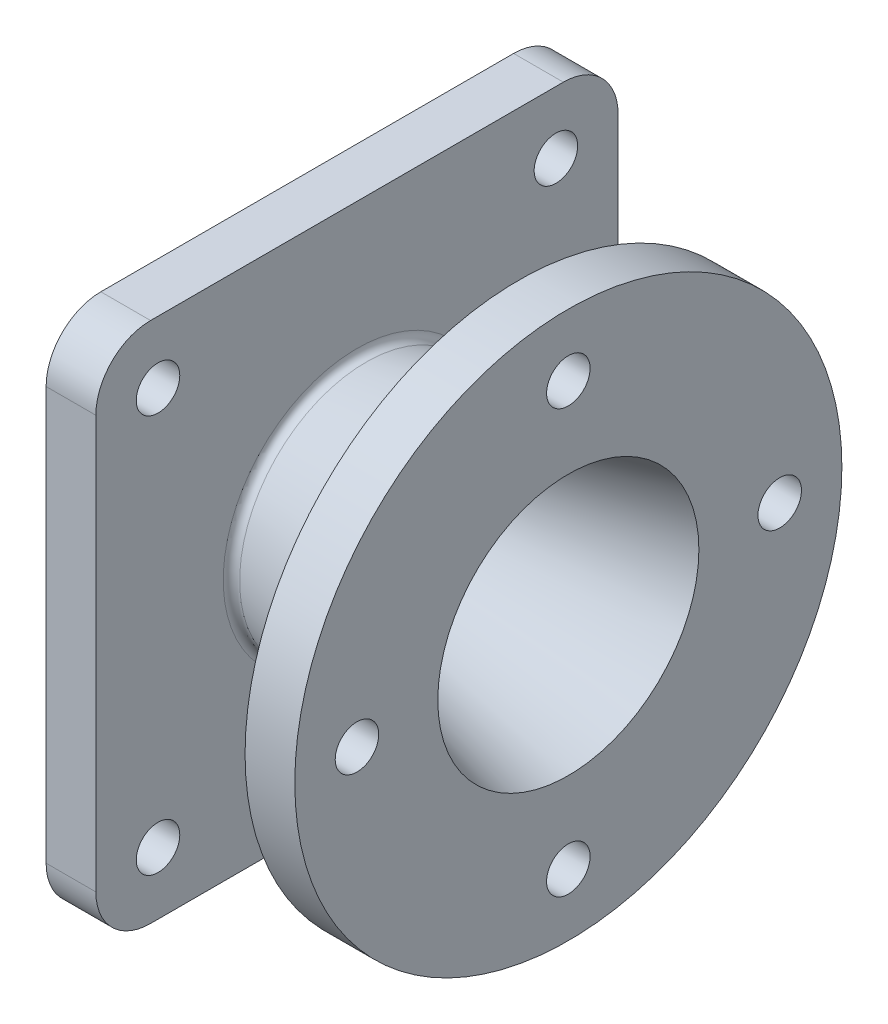
ISO-10303-21;
HEADER;
FILE_DESCRIPTION(('STEP AP214'),'2;1');
FILE_NAME('part.step','',(''),(''),'','','');
FILE_SCHEMA(('AUTOMOTIVE_DESIGN { 1 0 10303 214 1 1 1 1 }'));
ENDSEC;
DATA;
#1=APPLICATION_CONTEXT('core data for automotive mechanical design processes');
#2=APPLICATION_PROTOCOL_DEFINITION('international standard','automotive_design',2000,#1);
#3=PRODUCT_CONTEXT('',#1,'mechanical');
#4=PRODUCT('Part','Part','',(#3));
#5=PRODUCT_RELATED_PRODUCT_CATEGORY('part','',(#4));
#6=PRODUCT_DEFINITION_FORMATION('','',#4);
#7=PRODUCT_DEFINITION_CONTEXT('part definition',#1,'design');
#8=PRODUCT_DEFINITION('design','',#6,#7);
#9=PRODUCT_DEFINITION_SHAPE('','',#8);
#10=(LENGTH_UNIT() NAMED_UNIT(*) SI_UNIT(.MILLI.,.METRE.));
#11=(NAMED_UNIT(*) PLANE_ANGLE_UNIT() SI_UNIT($,.RADIAN.));
#12=(NAMED_UNIT(*) SI_UNIT($,.STERADIAN.) SOLID_ANGLE_UNIT());
#13=UNCERTAINTY_MEASURE_WITH_UNIT(LENGTH_MEASURE(1.E-05),#10,'distance_accuracy_value','');
#14=(GEOMETRIC_REPRESENTATION_CONTEXT(3) GLOBAL_UNCERTAINTY_ASSIGNED_CONTEXT((#13)) GLOBAL_UNIT_ASSIGNED_CONTEXT((#10,
#11,#12)) REPRESENTATION_CONTEXT('',''));
#15=CARTESIAN_POINT('',(0.,0.,0.));
#16=DIRECTION('',(0.,0.,1.));
#17=DIRECTION('',(1.,0.,0.));
#18=AXIS2_PLACEMENT_3D('',#15,#16,#17);
#19=CARTESIAN_POINT('',(-105.,0.,4.51745065771862E-13));
#20=DIRECTION('',(1.,0.,0.));
#21=DIRECTION('',(0.,0.,-1.00000000000003));
#22=AXIS2_PLACEMENT_3D('',#19,#20,#21);
#23=CONICAL_SURFACE('',#22,25.,0.256151382565604);
#24=CARTESIAN_POINT('',(0.,0.,0.));
#25=DIRECTION('',(1.,0.,0.));
#26=DIRECTION('',(0.,0.,-1.00000000000003));
#27=AXIS2_PLACEMENT_3D('',#24,#25,#26);
#28=CIRCLE('',#27,52.5);
#29=CARTESIAN_POINT('',(2.25872532885931E-13,0.,-52.5000000000015));
#30=VERTEX_POINT('',#29);
#31=EDGE_CURVE('E212',#30,#30,#28,.T.);
#32=ORIENTED_EDGE('',*,*,#31,.T.);
#33=EDGE_LOOP('',(#32));
#34=FACE_BOUND('',#33,.T.);
#35=CARTESIAN_POINT('',(-105.,0.,4.51745065771862E-13));
#36=DIRECTION('',(1.,0.,0.));
#37=DIRECTION('',(0.,0.,-1.00000000000003));
#38=AXIS2_PLACEMENT_3D('',#35,#36,#37);
#39=CIRCLE('',#38,25.);
#40=CARTESIAN_POINT('',(-105.,0.,-25.0000000000003));
#41=VERTEX_POINT('',#40);
#42=EDGE_CURVE('E124',#41,#41,#39,.T.);
#43=ORIENTED_EDGE('',*,*,#42,.F.);
#44=EDGE_LOOP('',(#43));
#45=FACE_BOUND('',#44,.T.);
#46=ADVANCED_FACE('F36',(#34,#45),#23,.F.);
#47=CARTESIAN_POINT('',(-105.,25.0000000000008,4.05948366006073E-13));
#48=DIRECTION('',(-1.,0.,0.));
#49=DIRECTION('',(0.,0.,1.00000000000003));
#50=AXIS2_PLACEMENT_3D('',#47,#48,#49);
#51=PLANE('',#50);
#52=ORIENTED_EDGE('',*,*,#42,.T.);
#53=EDGE_LOOP('',(#52));
#54=FACE_BOUND('',#53,.T.);
#55=CARTESIAN_POINT('',(-105.,0.,4.51745065771862E-13));
#56=DIRECTION('',(1.,0.,0.));
#57=DIRECTION('',(0.,0.,-1.00000000000003));
#58=AXIS2_PLACEMENT_3D('',#55,#56,#57);
#59=CIRCLE('',#58,35.);
#60=CARTESIAN_POINT('',(-105.,0.,-35.0000000000006));
#61=VERTEX_POINT('',#60);
#62=EDGE_CURVE('E128',#61,#61,#59,.T.);
#63=ORIENTED_EDGE('',*,*,#62,.F.);
#64=EDGE_LOOP('',(#63));
#65=FACE_BOUND('',#64,.T.);
#66=ADVANCED_FACE('F229',(#54,#65),#51,.T.);
#67=CARTESIAN_POINT('',(0.,0.,0.));
#68=DIRECTION('',(1.,0.,0.));
#69=DIRECTION('',(0.,0.,-1.00000000000003));
#70=AXIS2_PLACEMENT_3D('',#67,#68,#69);
#71=CYLINDRICAL_SURFACE('',#70,35.);
#72=ORIENTED_EDGE('',*,*,#62,.T.);
#73=EDGE_LOOP('',(#72));
#74=FACE_BOUND('',#73,.T.);
#75=CARTESIAN_POINT('',(-113.,0.,4.86163737449719E-13));
#76=DIRECTION('',(1.,0.,0.));
#77=DIRECTION('',(0.,0.,-1.00000000000003));
#78=AXIS2_PLACEMENT_3D('',#75,#76,#77);
#79=CIRCLE('',#78,35.);
#80=CARTESIAN_POINT('',(-113.,0.,-35.0000000000005));
#81=VERTEX_POINT('',#80);
#82=EDGE_CURVE('E221',#81,#81,#79,.T.);
#83=ORIENTED_EDGE('',*,*,#82,.F.);
#84=EDGE_LOOP('',(#83));
#85=FACE_BOUND('',#84,.T.);
#86=ADVANCED_FACE('F226',(#74,#85),#71,.F.);
#87=CARTESIAN_POINT('',(-113.,35.0000000000008,4.22048357777615E-13));
#88=DIRECTION('',(1.,0.,0.));
#89=DIRECTION('',(0.,0.,-1.00000000000003));
#90=AXIS2_PLACEMENT_3D('',#87,#88,#89);
#91=PLANE('',#90);
#92=ORIENTED_EDGE('',*,*,#82,.T.);
#93=EDGE_LOOP('',(#92));
#94=FACE_BOUND('',#93,.T.);
#95=CARTESIAN_POINT('',(-113.,0.,4.86163737449719E-13));
#96=DIRECTION('',(1.,0.,0.));
#97=DIRECTION('',(0.,0.,-1.00000000000003));
#98=AXIS2_PLACEMENT_3D('',#95,#96,#97);
#99=CIRCLE('',#98,28.7125);
#100=CARTESIAN_POINT('',(-113.,0.,-28.7125000000003));
#101=VERTEX_POINT('',#100);
#102=EDGE_CURVE('E218',#101,#101,#99,.T.);
#103=ORIENTED_EDGE('',*,*,#102,.F.);
#104=EDGE_LOOP('',(#103));
#105=FACE_BOUND('',#104,.T.);
#106=ADVANCED_FACE('F237',(#94,#105),#91,.T.);
#107=CARTESIAN_POINT('',(0.,0.,0.));
#108=DIRECTION('',(1.,0.,0.));
#109=DIRECTION('',(0.,0.,-1.00000000000003));
#110=AXIS2_PLACEMENT_3D('',#107,#108,#109);
#111=CYLINDRICAL_SURFACE('',#110,28.7125);
#112=CARTESIAN_POINT('',(-126.7125,0.,5.45159491872543E-13));
#113=DIRECTION('',(-1.,0.,0.));
#114=DIRECTION('',(0.,0.,1.00000000000003));
#115=AXIS2_PLACEMENT_3D('',#112,#113,#114);
#116=CIRCLE('',#115,28.7125);
#117=CARTESIAN_POINT('',(-126.7125,0.,28.7125000000012));
#118=VERTEX_POINT('',#117);
#119=EDGE_CURVE('E160',#118,#118,#116,.T.);
#120=ORIENTED_EDGE('',*,*,#119,.T.);
#121=EDGE_LOOP('',(#120));
#122=FACE_BOUND('',#121,.T.);
#123=ORIENTED_EDGE('',*,*,#102,.T.);
#124=EDGE_LOOP('',(#123));
#125=FACE_BOUND('',#124,.T.);
#126=ADVANCED_FACE('F276',(#122,#125),#111,.F.);
#127=CARTESIAN_POINT('',(-130.,62.5000000000024,4.4481166535069E-13));
#128=DIRECTION('',(-1.,0.,0.));
#129=DIRECTION('',(0.,0.,1.00000000000003));
#130=AXIS2_PLACEMENT_3D('',#127,#128,#129);
#131=PLANE('',#130);
#132=CARTESIAN_POINT('',(-130.,0.,5.59303414765163E-13));
#133=DIRECTION('',(-1.,0.,0.));
#134=DIRECTION('',(0.,0.,1.00000000000003));
#135=AXIS2_PLACEMENT_3D('',#132,#133,#134);
#136=CIRCLE('',#135,31.9999999999999);
#137=CARTESIAN_POINT('',(-130.,0.,32.0000000000012));
#138=VERTEX_POINT('',#137);
#139=EDGE_CURVE('E157',#138,#138,#136,.F.);
#140=ORIENTED_EDGE('',*,*,#139,.T.);
#141=EDGE_LOOP('',(#140));
#142=FACE_BOUND('',#141,.T.);
#143=CARTESIAN_POINT('',(-130.,0.,5.59303414765163E-13));
#144=DIRECTION('',(1.,0.,0.));
#145=DIRECTION('',(0.,0.,-1.00000000000003));
#146=AXIS2_PLACEMENT_3D('',#143,#144,#145);
#147=CIRCLE('',#146,62.5);
#148=CARTESIAN_POINT('',(-130.,1.14316369709669E-13,-62.5000000000013));
#149=VERTEX_POINT('',#148);
#150=EDGE_CURVE('E209',#149,#149,#147,.T.);
#151=ORIENTED_EDGE('',*,*,#150,.F.);
#152=EDGE_LOOP('',(#151));
#153=FACE_BOUND('',#152,.T.);
#154=ADVANCED_FACE('F272',(#142,#153),#131,.T.);
#155=CARTESIAN_POINT('',(0.,0.,0.));
#156=DIRECTION('',(1.,0.,0.));
#157=DIRECTION('',(0.,0.,-1.00000000000003));
#158=AXIS2_PLACEMENT_3D('',#155,#156,#157);
#159=CYLINDRICAL_SURFACE('',#158,62.5);
#160=ORIENTED_EDGE('',*,*,#150,.T.);
#161=EDGE_LOOP('',(#160));
#162=FACE_BOUND('',#161,.T.);
#163=CARTESIAN_POINT('',(-105.,0.,4.51745065771862E-13));
#164=DIRECTION('',(1.,0.,0.));
#165=DIRECTION('',(0.,0.,-1.00000000000003));
#166=AXIS2_PLACEMENT_3D('',#163,#164,#165);
#167=CIRCLE('',#166,62.5);
#168=CARTESIAN_POINT('',(-105.,1.14350096575978E-13,-62.5000000000014));
#169=VERTEX_POINT('',#168);
#170=EDGE_CURVE('E205',#169,#169,#167,.T.);
#171=ORIENTED_EDGE('',*,*,#170,.F.);
#172=EDGE_LOOP('',(#171));
#173=FACE_BOUND('',#172,.T.);
#174=ADVANCED_FACE('F275',(#162,#173),#159,.T.);
#175=CARTESIAN_POINT('',(-105.,105.000000000004,2.5939892675555E-13));
#176=DIRECTION('',(-1.,0.,0.));
#177=DIRECTION('',(0.,0.,1.00000000000003));
#178=AXIS2_PLACEMENT_3D('',#175,#176,#177);
#179=PLANE('',#178);
#180=CARTESIAN_POINT('',(-105.,80.0000000000036,-80.0000000000001));
#181=DIRECTION('',(-1.,0.,0.));
#182=DIRECTION('',(0.,1.00000000000003,0.));
#183=AXIS2_PLACEMENT_3D('',#180,#181,#182);
#184=CIRCLE('',#183,8.74999999999999);
#185=CARTESIAN_POINT('',(-105.,88.7500000000038,-80.));
#186=VERTEX_POINT('',#185);
#187=EDGE_CURVE('E616',#186,#186,#184,.T.);
#188=ORIENTED_EDGE('',*,*,#187,.F.);
#189=EDGE_LOOP('',(#188));
#190=FACE_BOUND('',#189,.T.);
#191=CARTESIAN_POINT('',(-105.,-80.000000000001,-80.));
#192=DIRECTION('',(-1.,0.,0.));
#193=DIRECTION('',(0.,0.,-1.00000000000003));
#194=AXIS2_PLACEMENT_3D('',#191,#192,#193);
#195=CIRCLE('',#194,8.74999999999999);
#196=CARTESIAN_POINT('',(-105.,-80.0000000000009,-88.7500000000003));
#197=VERTEX_POINT('',#196);
#198=EDGE_CURVE('E612',#197,#197,#195,.T.);
#199=ORIENTED_EDGE('',*,*,#198,.F.);
#200=EDGE_LOOP('',(#199));
#201=FACE_BOUND('',#200,.T.);
#202=CARTESIAN_POINT('',(-105.,-80.0000000000012,80.0000000000034));
#203=DIRECTION('',(-1.,0.,0.));
#204=DIRECTION('',(0.,-1.00000000000003,0.));
#205=AXIS2_PLACEMENT_3D('',#202,#203,#204);
#206=CIRCLE('',#205,8.74999999999999);
#207=CARTESIAN_POINT('',(-105.,-88.7500000000015,80.0000000000033));
#208=VERTEX_POINT('',#207);
#209=EDGE_CURVE('E608',#208,#208,#206,.T.);
#210=ORIENTED_EDGE('',*,*,#209,.F.);
#211=EDGE_LOOP('',(#210));
#212=FACE_BOUND('',#211,.T.);
#213=CARTESIAN_POINT('',(-105.,80.0000000000027,80.0000000000027));
#214=DIRECTION('',(-1.,0.,0.));
#215=DIRECTION('',(0.,0.,1.00000000000003));
#216=AXIS2_PLACEMENT_3D('',#213,#214,#215);
#217=CIRCLE('',#216,8.74999999999999);
#218=CARTESIAN_POINT('',(-105.,80.0000000000027,88.750000000003));
#219=VERTEX_POINT('',#218);
#220=EDGE_CURVE('E603',#219,#219,#217,.T.);
#221=ORIENTED_EDGE('',*,*,#220,.F.);
#222=EDGE_LOOP('',(#221));
#223=FACE_BOUND('',#222,.T.);
#224=ORIENTED_EDGE('',*,*,#170,.T.);
#225=EDGE_LOOP('',(#224));
#226=FACE_BOUND('',#225,.T.);
#227=DIRECTION('',(0.,0.,-1.00000000000003));
#228=VECTOR('',#227,1.);
#229=CARTESIAN_POINT('',(-105.,105.000000000005,-105.000000000003));
#230=LINE('',#229,#228);
#231=CARTESIAN_POINT('',(-105.,105.000000000004,83.0000000000027));
#232=VERTEX_POINT('',#231);
#233=CARTESIAN_POINT('',(-105.,105.000000000004,-83.0000000000009));
#234=VERTEX_POINT('',#233);
#235=EDGE_CURVE('E106',#232,#234,#230,.T.);
#236=ORIENTED_EDGE('',*,*,#235,.T.);
#237=CARTESIAN_POINT('',(-105.,83.0000000000027,-83.000000000001));
#238=DIRECTION('',(-1.,0.,0.));
#239=DIRECTION('',(0.,0.,1.00000000000003));
#240=AXIS2_PLACEMENT_3D('',#237,#238,#239);
#241=CIRCLE('',#240,22.);
#242=CARTESIAN_POINT('',(-105.,83.0000000000034,-105.000000000003));
#243=VERTEX_POINT('',#242);
#244=EDGE_CURVE('E135',#234,#243,#241,.T.);
#245=ORIENTED_EDGE('',*,*,#244,.T.);
#246=DIRECTION('',(0.,-1.00000000000003,0.));
#247=VECTOR('',#246,1.);
#248=CARTESIAN_POINT('',(-105.,-105.000000000002,-105.000000000002));
#249=LINE('',#248,#247);
#250=CARTESIAN_POINT('',(-105.,-83.0000000000009,-105.000000000002));
#251=VERTEX_POINT('',#250);
#252=EDGE_CURVE('E121',#243,#251,#249,.T.);
#253=ORIENTED_EDGE('',*,*,#252,.T.);
#254=CARTESIAN_POINT('',(-105.,-83.0000000000015,-83.0000000000006));
#255=DIRECTION('',(-1.,0.,0.));
#256=DIRECTION('',(0.,0.,1.00000000000003));
#257=AXIS2_PLACEMENT_3D('',#254,#255,#256);
#258=CIRCLE('',#257,22.);
#259=CARTESIAN_POINT('',(-105.,-105.000000000003,-83.0000000000006));
#260=VERTEX_POINT('',#259);
#261=EDGE_CURVE('E133',#251,#260,#258,.T.);
#262=ORIENTED_EDGE('',*,*,#261,.T.);
#263=DIRECTION('',(0.,0.,1.00000000000003));
#264=VECTOR('',#263,1.);
#265=CARTESIAN_POINT('',(-105.,-105.000000000002,-105.000000000002));
#266=LINE('',#265,#264);
#267=CARTESIAN_POINT('',(-105.,-105.000000000003,83.000000000003));
#268=VERTEX_POINT('',#267);
#269=EDGE_CURVE('E553',#260,#268,#266,.T.);
#270=ORIENTED_EDGE('',*,*,#269,.T.);
#271=CARTESIAN_POINT('',(-105.,-83.0000000000015,83.000000000003));
#272=DIRECTION('',(-1.,0.,0.));
#273=DIRECTION('',(0.,0.,1.00000000000003));
#274=AXIS2_PLACEMENT_3D('',#271,#272,#273);
#275=CIRCLE('',#274,22.);
#276=CARTESIAN_POINT('',(-105.,-83.0000000000021,105.000000000005));
#277=VERTEX_POINT('',#276);
#278=EDGE_CURVE('E112',#268,#277,#275,.T.);
#279=ORIENTED_EDGE('',*,*,#278,.T.);
#280=DIRECTION('',(0.,1.00000000000003,0.));
#281=VECTOR('',#280,1.);
#282=CARTESIAN_POINT('',(-105.,-105.000000000003,105.000000000005));
#283=LINE('',#282,#281);
#284=CARTESIAN_POINT('',(-105.,83.0000000000021,105.000000000005));
#285=VERTEX_POINT('',#284);
#286=EDGE_CURVE('E107',#277,#285,#283,.T.);
#287=ORIENTED_EDGE('',*,*,#286,.T.);
#288=CARTESIAN_POINT('',(-105.,83.0000000000027,83.0000000000027));
#289=DIRECTION('',(-1.,0.,0.));
#290=DIRECTION('',(0.,0.,1.00000000000003));
#291=AXIS2_PLACEMENT_3D('',#288,#289,#290);
#292=CIRCLE('',#291,22.);
#293=EDGE_CURVE('E103',#285,#232,#292,.T.);
#294=ORIENTED_EDGE('',*,*,#293,.T.);
#295=EDGE_LOOP('',(#236,#245,#253,#262,#270,#279,#287,#294));
#296=FACE_BOUND('',#295,.T.);
#297=ADVANCED_FACE('F105',(#190,#201,#212,#223,#226,#296),#179,.T.);
#298=CARTESIAN_POINT('',(-85.,50.0000000000014,2.74104987045644E-13));
#299=DIRECTION('',(1.,0.,0.));
#300=DIRECTION('',(0.,0.,-1.00000000000003));
#301=AXIS2_PLACEMENT_3D('',#298,#299,#300);
#302=PLANE('',#301);
#303=CARTESIAN_POINT('',(-85.,0.,3.65698386577222E-13));
#304=DIRECTION('',(1.,0.,0.));
#305=DIRECTION('',(0.,0.,-1.00000000000003));
#306=AXIS2_PLACEMENT_3D('',#303,#304,#305);
#307=CIRCLE('',#306,53.7711532455676);
#308=CARTESIAN_POINT('',(-84.9999999999998,0.,-53.7711532455688));
#309=VERTEX_POINT('',#308);
#310=EDGE_CURVE('E11',#309,#309,#307,.F.);
#311=ORIENTED_EDGE('',*,*,#310,.T.);
#312=EDGE_LOOP('',(#311));
#313=FACE_BOUND('',#312,.T.);
#314=CARTESIAN_POINT('',(-85.,80.0000000000027,-80.0000000000001));
#315=DIRECTION('',(1.,0.,0.));
#316=DIRECTION('',(0.,0.,-1.00000000000003));
#317=AXIS2_PLACEMENT_3D('',#314,#315,#316);
#318=CIRCLE('',#317,8.74999999999999);
#319=CARTESIAN_POINT('',(-85.,80.0000000000027,-88.7500000000003));
#320=VERTEX_POINT('',#319);
#321=EDGE_CURVE('E528',#320,#320,#318,.F.);
#322=ORIENTED_EDGE('',*,*,#321,.T.);
#323=EDGE_LOOP('',(#322));
#324=FACE_BOUND('',#323,.T.);
#325=CARTESIAN_POINT('',(-85.,-80.0000000000019,-80.0000000000003));
#326=DIRECTION('',(1.,0.,0.));
#327=DIRECTION('',(0.,0.,-1.00000000000003));
#328=AXIS2_PLACEMENT_3D('',#325,#326,#327);
#329=CIRCLE('',#328,8.74999999999999);
#330=CARTESIAN_POINT('',(-85.,-80.0000000000018,-88.7500000000006));
#331=VERTEX_POINT('',#330);
#332=EDGE_CURVE('E532',#331,#331,#329,.F.);
#333=ORIENTED_EDGE('',*,*,#332,.T.);
#334=EDGE_LOOP('',(#333));
#335=FACE_BOUND('',#334,.T.);
#336=CARTESIAN_POINT('',(-85.,-80.0000000000021,80.0000000000031));
#337=DIRECTION('',(1.,0.,0.));
#338=DIRECTION('',(0.,0.,-1.00000000000003));
#339=AXIS2_PLACEMENT_3D('',#336,#337,#338);
#340=CIRCLE('',#339,8.74999999999999);
#341=CARTESIAN_POINT('',(-85.,-80.0000000000021,71.2500000000028));
#342=VERTEX_POINT('',#341);
#343=EDGE_CURVE('E536',#342,#342,#340,.F.);
#344=ORIENTED_EDGE('',*,*,#343,.T.);
#345=EDGE_LOOP('',(#344));
#346=FACE_BOUND('',#345,.T.);
#347=CARTESIAN_POINT('',(-85.,80.0000000000018,80.0000000000027));
#348=DIRECTION('',(1.,0.,0.));
#349=DIRECTION('',(0.,0.,-1.00000000000003));
#350=AXIS2_PLACEMENT_3D('',#347,#348,#349);
#351=CIRCLE('',#350,8.74999999999999);
#352=CARTESIAN_POINT('',(-85.,80.0000000000018,71.2500000000025));
#353=VERTEX_POINT('',#352);
#354=EDGE_CURVE('E539',#353,#353,#351,.F.);
#355=ORIENTED_EDGE('',*,*,#354,.T.);
#356=EDGE_LOOP('',(#355));
#357=FACE_BOUND('',#356,.T.);
#358=DIRECTION('',(0.,-1.00000000000003,0.));
#359=VECTOR('',#358,1.);
#360=CARTESIAN_POINT('',(-85.,-105.000000000003,-105.000000000002));
#361=LINE('',#360,#359);
#362=CARTESIAN_POINT('',(-85.,83.0000000000024,-105.000000000003));
#363=VERTEX_POINT('',#362);
#364=CARTESIAN_POINT('',(-85.,-83.0000000000018,-105.000000000002));
#365=VERTEX_POINT('',#364);
#366=EDGE_CURVE('E542',#363,#365,#361,.T.);
#367=ORIENTED_EDGE('',*,*,#366,.F.);
#368=CARTESIAN_POINT('',(-85.,83.0000000000018,-83.000000000001));
#369=DIRECTION('',(1.,0.,0.));
#370=DIRECTION('',(0.,0.,-1.00000000000003));
#371=AXIS2_PLACEMENT_3D('',#368,#369,#370);
#372=CIRCLE('',#371,22.);
#373=CARTESIAN_POINT('',(-85.,105.000000000003,-83.0000000000009));
#374=VERTEX_POINT('',#373);
#375=EDGE_CURVE('E147',#363,#374,#372,.T.);
#376=ORIENTED_EDGE('',*,*,#375,.T.);
#377=DIRECTION('',(0.,0.,-1.00000000000003));
#378=VECTOR('',#377,1.);
#379=CARTESIAN_POINT('',(-85.,105.000000000004,-105.000000000003));
#380=LINE('',#379,#378);
#381=CARTESIAN_POINT('',(-85.,105.000000000003,83.0000000000027));
#382=VERTEX_POINT('',#381);
#383=EDGE_CURVE('E547',#382,#374,#380,.T.);
#384=ORIENTED_EDGE('',*,*,#383,.F.);
#385=CARTESIAN_POINT('',(-85.,83.0000000000018,83.0000000000027));
#386=DIRECTION('',(1.,0.,0.));
#387=DIRECTION('',(0.,0.,-1.00000000000003));
#388=AXIS2_PLACEMENT_3D('',#385,#386,#387);
#389=CIRCLE('',#388,22.);
#390=CARTESIAN_POINT('',(-85.,83.0000000000012,105.000000000005));
#391=VERTEX_POINT('',#390);
#392=EDGE_CURVE('E51',#382,#391,#389,.T.);
#393=ORIENTED_EDGE('',*,*,#392,.T.);
#394=DIRECTION('',(0.,1.00000000000003,0.));
#395=VECTOR('',#394,1.);
#396=CARTESIAN_POINT('',(-85.,-105.000000000004,105.000000000005));
#397=LINE('',#396,#395);
#398=CARTESIAN_POINT('',(-85.,-83.000000000003,105.000000000005));
#399=VERTEX_POINT('',#398);
#400=EDGE_CURVE('E561',#399,#391,#397,.T.);
#401=ORIENTED_EDGE('',*,*,#400,.F.);
#402=CARTESIAN_POINT('',(-85.,-83.0000000000024,83.000000000003));
#403=DIRECTION('',(1.,0.,0.));
#404=DIRECTION('',(0.,0.,-1.00000000000003));
#405=AXIS2_PLACEMENT_3D('',#402,#403,#404);
#406=CIRCLE('',#405,22.);
#407=CARTESIAN_POINT('',(-85.,-105.000000000004,83.000000000003));
#408=VERTEX_POINT('',#407);
#409=EDGE_CURVE('E143',#399,#408,#406,.T.);
#410=ORIENTED_EDGE('',*,*,#409,.T.);
#411=DIRECTION('',(0.,0.,1.00000000000003));
#412=VECTOR('',#411,1.);
#413=CARTESIAN_POINT('',(-85.,-105.000000000003,-105.000000000002));
#414=LINE('',#413,#412);
#415=CARTESIAN_POINT('',(-85.,-105.000000000004,-83.0000000000006));
#416=VERTEX_POINT('',#415);
#417=EDGE_CURVE('E548',#416,#408,#414,.T.);
#418=ORIENTED_EDGE('',*,*,#417,.F.);
#419=CARTESIAN_POINT('',(-85.,-83.0000000000024,-83.0000000000006));
#420=DIRECTION('',(1.,0.,0.));
#421=DIRECTION('',(0.,0.,-1.00000000000003));
#422=AXIS2_PLACEMENT_3D('',#419,#420,#421);
#423=CIRCLE('',#422,22.);
#424=EDGE_CURVE('E145',#416,#365,#423,.T.);
#425=ORIENTED_EDGE('',*,*,#424,.T.);
#426=EDGE_LOOP('',(#367,#376,#384,#393,#401,#410,#418,#425));
#427=FACE_BOUND('',#426,.T.);
#428=ADVANCED_FACE('F286',(#313,#324,#335,#346,#357,#427),#302,.T.);
#429=CARTESIAN_POINT('',(-20.,0.,0.));
#430=DIRECTION('',(1.,0.,0.));
#431=DIRECTION('',(0.,0.,-1.00000000000003));
#432=AXIS2_PLACEMENT_3D('',#429,#430,#431);
#433=CONICAL_SURFACE('',#432,65.,0.226798848053886);
#434=CARTESIAN_POINT('',(-22.3254214799037,0.,0.));
#435=DIRECTION('',(1.,0.,0.));
#436=DIRECTION('',(0.,0.,-1.00000000000003));
#437=AXIS2_PLACEMENT_3D('',#434,#435,#436);
#438=CIRCLE('',#437,64.4633642738684);
#439=CARTESIAN_POINT('',(-22.3254214799034,1.24997148825408E-13,-64.4633642738702));
#440=VERTEX_POINT('',#439);
#441=EDGE_CURVE('E44',#440,#440,#438,.F.);
#442=ORIENTED_EDGE('',*,*,#441,.T.);
#443=EDGE_LOOP('',(#442));
#444=FACE_BOUND('',#443,.T.);
#445=CARTESIAN_POINT('',(-81.3254214799037,0.,3.49889122622511E-13));
#446=DIRECTION('',(1.,0.,0.));
#447=DIRECTION('',(0.,0.,-1.00000000000003));
#448=AXIS2_PLACEMENT_3D('',#445,#446,#447);
#449=CIRCLE('',#448,50.8479796584837);
#450=CARTESIAN_POINT('',(-81.3254214799035,0.,-50.8479796584849));
#451=VERTEX_POINT('',#450);
#452=EDGE_CURVE('E166',#451,#451,#449,.T.);
#453=ORIENTED_EDGE('',*,*,#452,.T.);
#454=EDGE_LOOP('',(#453));
#455=FACE_BOUND('',#454,.T.);
#456=ADVANCED_FACE('F171',(#444,#455),#433,.T.);
#457=CARTESIAN_POINT('',(-19.9999999999999,110.000000000004,-1.15458799774835E-13));
#458=DIRECTION('',(-1.,0.,0.));
#459=DIRECTION('',(0.,0.,1.00000000000003));
#460=AXIS2_PLACEMENT_3D('',#457,#458,#459);
#461=PLANE('',#460);
#462=CARTESIAN_POINT('',(-20.,0.,0.));
#463=DIRECTION('',(-1.,0.,0.));
#464=DIRECTION('',(0.,0.,1.00000000000003));
#465=AXIS2_PLACEMENT_3D('',#462,#463,#464);
#466=CIRCLE('',#465,67.3865378609522);
#467=CARTESIAN_POINT('',(-20.0000000000003,-1.23470223200007E-13,67.3865378609543));
#468=VERTEX_POINT('',#467);
#469=EDGE_CURVE('E163',#468,#468,#466,.F.);
#470=ORIENTED_EDGE('',*,*,#469,.T.);
#471=EDGE_LOOP('',(#470));
#472=FACE_BOUND('',#471,.T.);
#473=CARTESIAN_POINT('',(-20.,1.01020658197681E-12,-85.0000000000009));
#474=DIRECTION('',(-1.,0.,0.));
#475=DIRECTION('',(0.,0.,1.00000000000003));
#476=AXIS2_PLACEMENT_3D('',#473,#474,#475);
#477=CIRCLE('',#476,8.75);
#478=CARTESIAN_POINT('',(-20.0000000000001,9.94177737058781E-13,-76.2500000000007));
#479=VERTEX_POINT('',#478);
#480=EDGE_CURVE('E188',#479,#479,#477,.F.);
#481=ORIENTED_EDGE('',*,*,#480,.T.);
#482=EDGE_LOOP('',(#481));
#483=FACE_BOUND('',#482,.T.);
#484=CARTESIAN_POINT('',(-20.,-85.0000000000025,2.41755458398324E-13));
#485=DIRECTION('',(-1.,0.,0.));
#486=DIRECTION('',(0.,0.,1.00000000000003));
#487=AXIS2_PLACEMENT_3D('',#484,#485,#486);
#488=CIRCLE('',#487,8.75);
#489=CARTESIAN_POINT('',(-20.0000000000001,-85.0000000000025,8.7500000000005));
#490=VERTEX_POINT('',#489);
#491=EDGE_CURVE('E192',#490,#490,#488,.F.);
#492=ORIENTED_EDGE('',*,*,#491,.T.);
#493=EDGE_LOOP('',(#492));
#494=FACE_BOUND('',#493,.T.);
#495=CARTESIAN_POINT('',(-20.,-4.16985116178832E-13,85.0000000000028));
#496=DIRECTION('',(-1.,0.,0.));
#497=DIRECTION('',(0.,0.,1.00000000000003));
#498=AXIS2_PLACEMENT_3D('',#495,#496,#497);
#499=CIRCLE('',#498,8.75);
#500=CARTESIAN_POINT('',(-20.0000000000001,-4.33013961096858E-13,93.750000000003));
#501=VERTEX_POINT('',#500);
#502=EDGE_CURVE('E196',#501,#501,#499,.F.);
#503=ORIENTED_EDGE('',*,*,#502,.T.);
#504=EDGE_LOOP('',(#503));
#505=FACE_BOUND('',#504,.T.);
#506=CARTESIAN_POINT('',(-19.9999999999999,85.0000000000018,0.));
#507=DIRECTION('',(-1.,0.,0.));
#508=DIRECTION('',(0.,0.,1.00000000000003));
#509=AXIS2_PLACEMENT_3D('',#506,#507,#508);
#510=CIRCLE('',#509,8.75);
#511=CARTESIAN_POINT('',(-19.9999999999999,85.0000000000018,8.75000000000019));
#512=VERTEX_POINT('',#511);
#513=EDGE_CURVE('E200',#512,#512,#510,.F.);
#514=ORIENTED_EDGE('',*,*,#513,.T.);
#515=EDGE_LOOP('',(#514));
#516=FACE_BOUND('',#515,.T.);
#517=CARTESIAN_POINT('',(-19.9999999999999,0.,0.));
#518=DIRECTION('',(1.,0.,0.));
#519=DIRECTION('',(0.,0.,-1.00000000000003));
#520=AXIS2_PLACEMENT_3D('',#517,#518,#519);
#521=CIRCLE('',#520,110.);
#522=CARTESIAN_POINT('',(-19.9999999999994,2.01478497476425E-13,-110.000000000003));
#523=VERTEX_POINT('',#522);
#524=EDGE_CURVE('E203',#523,#523,#521,.T.);
#525=ORIENTED_EDGE('',*,*,#524,.F.);
#526=EDGE_LOOP('',(#525));
#527=FACE_BOUND('',#526,.T.);
#528=ADVANCED_FACE('F180',(#472,#483,#494,#505,#516,#527),#461,.T.);
#529=CARTESIAN_POINT('',(0.,0.,0.));
#530=DIRECTION('',(1.,0.,0.));
#531=DIRECTION('',(0.,0.,-1.00000000000003));
#532=AXIS2_PLACEMENT_3D('',#529,#530,#531);
#533=CYLINDRICAL_SURFACE('',#532,110.);
#534=ORIENTED_EDGE('',*,*,#524,.T.);
#535=EDGE_LOOP('',(#534));
#536=FACE_BOUND('',#535,.T.);
#537=CARTESIAN_POINT('',(0.,0.,0.));
#538=DIRECTION('',(1.,0.,0.));
#539=DIRECTION('',(0.,0.,-1.00000000000003));
#540=AXIS2_PLACEMENT_3D('',#537,#538,#539);
#541=CIRCLE('',#540,110.);
#542=CARTESIAN_POINT('',(4.73256735570522E-13,2.01505478969472E-13,-110.000000000003));
#543=VERTEX_POINT('',#542);
#544=EDGE_CURVE('E206',#543,#543,#541,.T.);
#545=ORIENTED_EDGE('',*,*,#544,.F.);
#546=EDGE_LOOP('',(#545));
#547=FACE_BOUND('',#546,.T.);
#548=ADVANCED_FACE('F183',(#536,#547),#533,.T.);
#549=CARTESIAN_POINT('',(0.,52.5000000000014,0.));
#550=DIRECTION('',(1.,0.,0.));
#551=DIRECTION('',(0.,0.,-1.00000000000003));
#552=AXIS2_PLACEMENT_3D('',#549,#550,#551);
#553=PLANE('',#552);
#554=CARTESIAN_POINT('',(0.,1.00329466956595E-12,-85.0000000000009));
#555=DIRECTION('',(1.,0.,0.));
#556=DIRECTION('',(0.,-1.00000000000003,0.));
#557=AXIS2_PLACEMENT_3D('',#554,#555,#556);
#558=CIRCLE('',#557,8.75);
#559=CARTESIAN_POINT('',(0.,-8.74999999999926,-85.000000000001));
#560=VERTEX_POINT('',#559);
#561=EDGE_CURVE('E565',#560,#560,#558,.T.);
#562=ORIENTED_EDGE('',*,*,#561,.F.);
#563=EDGE_LOOP('',(#562));
#564=FACE_BOUND('',#563,.T.);
#565=CARTESIAN_POINT('',(0.,-85.0000000000018,1.55708779203682E-13));
#566=DIRECTION('',(1.,0.,0.));
#567=DIRECTION('',(0.,0.,1.00000000000003));
#568=AXIS2_PLACEMENT_3D('',#565,#566,#567);
#569=CIRCLE('',#568,8.75);
#570=CARTESIAN_POINT('',(0.,-85.0000000000018,8.75000000000042));
#571=VERTEX_POINT('',#570);
#572=EDGE_CURVE('E569',#571,#571,#569,.T.);
#573=ORIENTED_EDGE('',*,*,#572,.F.);
#574=EDGE_LOOP('',(#573));
#575=FACE_BOUND('',#574,.T.);
#576=CARTESIAN_POINT('',(0.,-4.84612350248881E-13,85.0000000000028));
#577=DIRECTION('',(1.,0.,0.));
#578=DIRECTION('',(0.,1.00000000000003,0.));
#579=AXIS2_PLACEMENT_3D('',#576,#577,#578);
#580=CIRCLE('',#579,8.75);
#581=CARTESIAN_POINT('',(0.,8.74999999999978,85.0000000000028));
#582=VERTEX_POINT('',#581);
#583=EDGE_CURVE('E573',#582,#582,#580,.T.);
#584=ORIENTED_EDGE('',*,*,#583,.F.);
#585=EDGE_LOOP('',(#584));
#586=FACE_BOUND('',#585,.T.);
#587=CARTESIAN_POINT('',(0.,85.0000000000025,-1.55708779203687E-13));
#588=DIRECTION('',(1.,0.,0.));
#589=DIRECTION('',(0.,0.,-1.00000000000003));
#590=AXIS2_PLACEMENT_3D('',#587,#588,#589);
#591=CIRCLE('',#590,8.75);
#592=CARTESIAN_POINT('',(0.,85.0000000000025,-8.75000000000042));
#593=VERTEX_POINT('',#592);
#594=EDGE_CURVE('E577',#593,#593,#591,.T.);
#595=ORIENTED_EDGE('',*,*,#594,.F.);
#596=EDGE_LOOP('',(#595));
#597=FACE_BOUND('',#596,.T.);
#598=ORIENTED_EDGE('',*,*,#544,.T.);
#599=EDGE_LOOP('',(#598));
#600=FACE_BOUND('',#599,.T.);
#601=ORIENTED_EDGE('',*,*,#31,.F.);
#602=EDGE_LOOP('',(#601));
#603=FACE_BOUND('',#602,.T.);
#604=ADVANCED_FACE('F358',(#564,#575,#586,#597,#600,#603),#553,.T.);
#605=CARTESIAN_POINT('',(-130.001,85.0000000000025,4.0359893789544E-13));
#606=DIRECTION('',(1.,0.,0.));
#607=DIRECTION('',(0.,0.,-1.00000000000003));
#608=AXIS2_PLACEMENT_3D('',#605,#606,#607);
#609=CYLINDRICAL_SURFACE('',#608,8.75);
#610=ORIENTED_EDGE('',*,*,#513,.F.);
#611=EDGE_LOOP('',(#610));
#612=FACE_BOUND('',#611,.T.);
#613=ORIENTED_EDGE('',*,*,#594,.T.);
#614=EDGE_LOOP('',(#613));
#615=FACE_BOUND('',#614,.T.);
#616=ADVANCED_FACE('F367',(#612,#615),#609,.F.);
#617=CARTESIAN_POINT('',(-130.001,-4.84787731302759E-13,85.0000000000037));
#618=DIRECTION('',(1.,0.,0.));
#619=DIRECTION('',(0.,0.,-1.00000000000003));
#620=AXIS2_PLACEMENT_3D('',#617,#618,#619);
#621=CYLINDRICAL_SURFACE('',#620,8.75);
#622=ORIENTED_EDGE('',*,*,#502,.F.);
#623=EDGE_LOOP('',(#622));
#624=FACE_BOUND('',#623,.T.);
#625=ORIENTED_EDGE('',*,*,#583,.T.);
#626=EDGE_LOOP('',(#625));
#627=FACE_BOUND('',#626,.T.);
#628=ADVANCED_FACE('F377',(#624,#627),#621,.F.);
#629=CARTESIAN_POINT('',(-130.001,-85.0000000000018,7.15016496302806E-13));
#630=DIRECTION('',(1.,0.,0.));
#631=DIRECTION('',(0.,0.,-1.00000000000003));
#632=AXIS2_PLACEMENT_3D('',#629,#630,#631);
#633=CYLINDRICAL_SURFACE('',#632,8.75);
#634=ORIENTED_EDGE('',*,*,#491,.F.);
#635=EDGE_LOOP('',(#634));
#636=FACE_BOUND('',#635,.T.);
#637=ORIENTED_EDGE('',*,*,#572,.T.);
#638=EDGE_LOOP('',(#637));
#639=FACE_BOUND('',#638,.T.);
#640=ADVANCED_FACE('F387',(#636,#639),#633,.F.);
#641=CARTESIAN_POINT('',(-130.001,1.00311928851207E-12,-85.));
#642=DIRECTION('',(1.,0.,0.));
#643=DIRECTION('',(0.,0.,-1.00000000000003));
#644=AXIS2_PLACEMENT_3D('',#641,#642,#643);
#645=CYLINDRICAL_SURFACE('',#644,8.75);
#646=ORIENTED_EDGE('',*,*,#480,.F.);
#647=EDGE_LOOP('',(#646));
#648=FACE_BOUND('',#647,.T.);
#649=ORIENTED_EDGE('',*,*,#561,.T.);
#650=EDGE_LOOP('',(#649));
#651=FACE_BOUND('',#650,.T.);
#652=ADVANCED_FACE('F397',(#648,#651),#645,.F.);
#653=CARTESIAN_POINT('',(211.98484809835,-105.000000000004,105.000000000003));
#654=DIRECTION('',(0.,0.,1.00000000000003));
#655=DIRECTION('',(1.,0.,0.));
#656=AXIS2_PLACEMENT_3D('',#653,#654,#655);
#657=PLANE('',#656);
#658=ORIENTED_EDGE('',*,*,#286,.F.);
#659=DIRECTION('',(-1.,0.,0.));
#660=VECTOR('',#659,1.);
#661=CARTESIAN_POINT('',(211.98484809835,-83.0000000000024,105.000000000003));
#662=LINE('',#661,#660);
#663=EDGE_CURVE('E58',#277,#399,#662,.F.);
#664=ORIENTED_EDGE('',*,*,#663,.T.);
#665=ORIENTED_EDGE('',*,*,#400,.T.);
#666=DIRECTION('',(-1.,0.,0.));
#667=VECTOR('',#666,1.);
#668=CARTESIAN_POINT('',(211.98484809835,83.0000000000018,105.000000000003));
#669=LINE('',#668,#667);
#670=EDGE_CURVE('E154',#391,#285,#669,.T.);
#671=ORIENTED_EDGE('',*,*,#670,.T.);
#672=EDGE_LOOP('',(#658,#664,#665,#671));
#673=FACE_BOUND('',#672,.T.);
#674=ADVANCED_FACE('F406',(#673),#657,.T.);
#675=CARTESIAN_POINT('',(211.98484809835,-105.000000000003,-105.000000000004));
#676=DIRECTION('',(0.,-1.00000000000003,0.));
#677=DIRECTION('',(0.,0.,-1.00000000000003));
#678=AXIS2_PLACEMENT_3D('',#675,#676,#677);
#679=PLANE('',#678);
#680=ORIENTED_EDGE('',*,*,#269,.F.);
#681=DIRECTION('',(-1.,0.,0.));
#682=VECTOR('',#681,1.);
#683=CARTESIAN_POINT('',(211.98484809835,-105.000000000003,-83.0000000000021));
#684=LINE('',#683,#682);
#685=EDGE_CURVE('E152',#260,#416,#684,.F.);
#686=ORIENTED_EDGE('',*,*,#685,.T.);
#687=ORIENTED_EDGE('',*,*,#417,.T.);
#688=DIRECTION('',(-1.,0.,0.));
#689=VECTOR('',#688,1.);
#690=CARTESIAN_POINT('',(211.98484809835,-105.000000000003,83.0000000000015));
#691=LINE('',#690,#689);
#692=EDGE_CURVE('E149',#408,#268,#691,.T.);
#693=ORIENTED_EDGE('',*,*,#692,.T.);
#694=EDGE_LOOP('',(#680,#686,#687,#693));
#695=FACE_BOUND('',#694,.T.);
#696=ADVANCED_FACE('F415',(#695),#679,.T.);
#697=CARTESIAN_POINT('',(211.98484809835,-105.000000000003,-105.000000000004));
#698=DIRECTION('',(0.,0.,-1.00000000000003));
#699=DIRECTION('',(-1.,0.,0.));
#700=AXIS2_PLACEMENT_3D('',#697,#698,#699);
#701=PLANE('',#700);
#702=ORIENTED_EDGE('',*,*,#252,.F.);
#703=DIRECTION('',(-1.,0.,0.));
#704=VECTOR('',#703,1.);
#705=CARTESIAN_POINT('',(211.98484809835,83.0000000000024,-105.000000000004));
#706=LINE('',#705,#704);
#707=EDGE_CURVE('E140',#243,#363,#706,.F.);
#708=ORIENTED_EDGE('',*,*,#707,.T.);
#709=ORIENTED_EDGE('',*,*,#366,.T.);
#710=DIRECTION('',(-1.,0.,0.));
#711=VECTOR('',#710,1.);
#712=CARTESIAN_POINT('',(211.98484809835,-83.0000000000018,-105.000000000004));
#713=LINE('',#712,#711);
#714=EDGE_CURVE('E137',#365,#251,#713,.T.);
#715=ORIENTED_EDGE('',*,*,#714,.T.);
#716=EDGE_LOOP('',(#702,#708,#709,#715));
#717=FACE_BOUND('',#716,.T.);
#718=ADVANCED_FACE('F424',(#717),#701,.T.);
#719=CARTESIAN_POINT('',(211.98484809835,105.000000000004,-105.000000000004));
#720=DIRECTION('',(0.,1.00000000000003,0.));
#721=DIRECTION('',(0.,0.,1.00000000000003));
#722=AXIS2_PLACEMENT_3D('',#719,#720,#721);
#723=PLANE('',#722);
#724=ORIENTED_EDGE('',*,*,#383,.T.);
#725=DIRECTION('',(-1.,0.,0.));
#726=VECTOR('',#725,1.);
#727=CARTESIAN_POINT('',(211.98484809835,105.000000000004,-83.0000000000021));
#728=LINE('',#727,#726);
#729=EDGE_CURVE('E113',#374,#234,#728,.T.);
#730=ORIENTED_EDGE('',*,*,#729,.T.);
#731=ORIENTED_EDGE('',*,*,#235,.F.);
#732=DIRECTION('',(-1.,0.,0.));
#733=VECTOR('',#732,1.);
#734=CARTESIAN_POINT('',(211.98484809835,105.000000000004,83.0000000000015));
#735=LINE('',#734,#733);
#736=EDGE_CURVE('E119',#232,#382,#735,.F.);
#737=ORIENTED_EDGE('',*,*,#736,.T.);
#738=EDGE_LOOP('',(#724,#730,#731,#737));
#739=FACE_BOUND('',#738,.T.);
#740=ADVANCED_FACE('F118',(#739),#723,.T.);
#741=CARTESIAN_POINT('',(-60.2512626584709,80.0000000000018,80.0000000000027));
#742=DIRECTION('',(-1.,0.,0.));
#743=DIRECTION('',(0.,0.,1.00000000000003));
#744=AXIS2_PLACEMENT_3D('',#741,#742,#743);
#745=CYLINDRICAL_SURFACE('',#744,8.74999999999999);
#746=ORIENTED_EDGE('',*,*,#220,.T.);
#747=EDGE_LOOP('',(#746));
#748=FACE_BOUND('',#747,.T.);
#749=ORIENTED_EDGE('',*,*,#354,.F.);
#750=EDGE_LOOP('',(#749));
#751=FACE_BOUND('',#750,.T.);
#752=ADVANCED_FACE('F247',(#748,#751),#745,.F.);
#753=CARTESIAN_POINT('',(211.98484809835,83.0000000000024,-83.0000000000022));
#754=DIRECTION('',(-1.,0.,0.));
#755=DIRECTION('',(0.,0.,1.00000000000003));
#756=AXIS2_PLACEMENT_3D('',#753,#754,#755);
#757=CYLINDRICAL_SURFACE('',#756,22.);
#758=ORIENTED_EDGE('',*,*,#375,.F.);
#759=ORIENTED_EDGE('',*,*,#707,.F.);
#760=ORIENTED_EDGE('',*,*,#244,.F.);
#761=ORIENTED_EDGE('',*,*,#729,.F.);
#762=EDGE_LOOP('',(#758,#759,#760,#761));
#763=FACE_BOUND('',#762,.T.);
#764=ADVANCED_FACE('F243',(#763),#757,.T.);
#765=CARTESIAN_POINT('',(211.98484809835,-83.0000000000018,-83.0000000000021));
#766=DIRECTION('',(-1.,0.,0.));
#767=DIRECTION('',(0.,0.,1.00000000000003));
#768=AXIS2_PLACEMENT_3D('',#765,#766,#767);
#769=CYLINDRICAL_SURFACE('',#768,22.);
#770=ORIENTED_EDGE('',*,*,#424,.F.);
#771=ORIENTED_EDGE('',*,*,#685,.F.);
#772=ORIENTED_EDGE('',*,*,#261,.F.);
#773=ORIENTED_EDGE('',*,*,#714,.F.);
#774=EDGE_LOOP('',(#770,#771,#772,#773));
#775=FACE_BOUND('',#774,.T.);
#776=ADVANCED_FACE('F246',(#775),#769,.T.);
#777=CARTESIAN_POINT('',(211.98484809835,-83.0000000000018,83.0000000000015));
#778=DIRECTION('',(-1.,0.,0.));
#779=DIRECTION('',(0.,0.,1.00000000000003));
#780=AXIS2_PLACEMENT_3D('',#777,#778,#779);
#781=CYLINDRICAL_SURFACE('',#780,22.);
#782=ORIENTED_EDGE('',*,*,#409,.F.);
#783=ORIENTED_EDGE('',*,*,#663,.F.);
#784=ORIENTED_EDGE('',*,*,#278,.F.);
#785=ORIENTED_EDGE('',*,*,#692,.F.);
#786=EDGE_LOOP('',(#782,#783,#784,#785));
#787=FACE_BOUND('',#786,.T.);
#788=ADVANCED_FACE('F251',(#787),#781,.T.);
#789=CARTESIAN_POINT('',(211.98484809835,83.0000000000024,83.0000000000015));
#790=DIRECTION('',(-1.,0.,0.));
#791=DIRECTION('',(0.,0.,1.00000000000003));
#792=AXIS2_PLACEMENT_3D('',#789,#790,#791);
#793=CYLINDRICAL_SURFACE('',#792,22.);
#794=ORIENTED_EDGE('',*,*,#392,.F.);
#795=ORIENTED_EDGE('',*,*,#736,.F.);
#796=ORIENTED_EDGE('',*,*,#293,.F.);
#797=ORIENTED_EDGE('',*,*,#670,.F.);
#798=EDGE_LOOP('',(#794,#795,#796,#797));
#799=FACE_BOUND('',#798,.T.);
#800=ADVANCED_FACE('F123',(#799),#793,.T.);
#801=CARTESIAN_POINT('',(-60.2512626584709,-80.0000000000021,80.0000000000031));
#802=DIRECTION('',(-1.,0.,0.));
#803=DIRECTION('',(0.,0.,1.00000000000003));
#804=AXIS2_PLACEMENT_3D('',#801,#802,#803);
#805=CYLINDRICAL_SURFACE('',#804,8.74999999999999);
#806=ORIENTED_EDGE('',*,*,#209,.T.);
#807=EDGE_LOOP('',(#806));
#808=FACE_BOUND('',#807,.T.);
#809=ORIENTED_EDGE('',*,*,#343,.F.);
#810=EDGE_LOOP('',(#809));
#811=FACE_BOUND('',#810,.T.);
#812=ADVANCED_FACE('F258',(#808,#811),#805,.F.);
#813=CARTESIAN_POINT('',(-60.2512626584709,-80.0000000000013,-80.0000000000003));
#814=DIRECTION('',(-1.,0.,0.));
#815=DIRECTION('',(0.,0.,1.00000000000003));
#816=AXIS2_PLACEMENT_3D('',#813,#814,#815);
#817=CYLINDRICAL_SURFACE('',#816,8.74999999999999);
#818=ORIENTED_EDGE('',*,*,#198,.T.);
#819=EDGE_LOOP('',(#818));
#820=FACE_BOUND('',#819,.T.);
#821=ORIENTED_EDGE('',*,*,#332,.F.);
#822=EDGE_LOOP('',(#821));
#823=FACE_BOUND('',#822,.T.);
#824=ADVANCED_FACE('F265',(#820,#823),#817,.F.);
#825=CARTESIAN_POINT('',(-60.2512626584709,80.0000000000033,-80.0000000000001));
#826=DIRECTION('',(-1.,0.,0.));
#827=DIRECTION('',(0.,0.,1.00000000000003));
#828=AXIS2_PLACEMENT_3D('',#825,#826,#827);
#829=CYLINDRICAL_SURFACE('',#828,8.74999999999999);
#830=ORIENTED_EDGE('',*,*,#187,.T.);
#831=EDGE_LOOP('',(#830));
#832=FACE_BOUND('',#831,.T.);
#833=ORIENTED_EDGE('',*,*,#321,.F.);
#834=EDGE_LOOP('',(#833));
#835=FACE_BOUND('',#834,.T.);
#836=ADVANCED_FACE('F260',(#832,#835),#829,.F.);
#837=CARTESIAN_POINT('',(-130.,0.,5.59303414765163E-13));
#838=DIRECTION('',(-1.,0.,0.));
#839=DIRECTION('',(0.,0.,1.00000000000003));
#840=AXIS2_PLACEMENT_3D('',#837,#838,#839);
#841=CONICAL_SURFACE('',#840,31.9999999999999,0.78539816339745);
#842=CARTESIAN_POINT('',(-126.7125,0.,28.7125000000012));
#843=CARTESIAN_POINT('',(-126.746744791667,0.,28.7467447916679));
#844=CARTESIAN_POINT('',(-126.780989583333,0.,28.7809895833345));
#845=CARTESIAN_POINT('',(-126.849479166667,0.,28.8494791666679));
#846=CARTESIAN_POINT('',(-126.883723958333,0.,28.8837239583345));
#847=CARTESIAN_POINT('',(-126.952213541667,0.,28.9522135416679));
#848=CARTESIAN_POINT('',(-126.986458333333,0.,28.9864583333345));
#849=CARTESIAN_POINT('',(-127.054947916667,0.,29.0549479166679));
#850=CARTESIAN_POINT('',(-127.089192708333,0.,29.0891927083345));
#851=CARTESIAN_POINT('',(-127.157682291667,0.,29.1576822916679));
#852=CARTESIAN_POINT('',(-127.191927083333,0.,29.1919270833345));
#853=CARTESIAN_POINT('',(-127.260416666667,0.,29.2604166666679));
#854=CARTESIAN_POINT('',(-127.294661458333,0.,29.2946614583345));
#855=CARTESIAN_POINT('',(-127.363151041667,0.,29.3631510416679));
#856=CARTESIAN_POINT('',(-127.397395833333,0.,29.3973958333345));
#857=CARTESIAN_POINT('',(-127.465885416667,0.,29.4658854166679));
#858=CARTESIAN_POINT('',(-127.500130208333,0.,29.5001302083345));
#859=CARTESIAN_POINT('',(-127.568619791667,0.,29.5686197916679));
#860=CARTESIAN_POINT('',(-127.602864583333,0.,29.6028645833345));
#861=CARTESIAN_POINT('',(-127.671354166667,0.,29.6713541666679));
#862=CARTESIAN_POINT('',(-127.705598958333,0.,29.7055989583345));
#863=CARTESIAN_POINT('',(-127.774088541667,0.,29.7740885416679));
#864=CARTESIAN_POINT('',(-127.808333333333,0.,29.8083333333345));
#865=CARTESIAN_POINT('',(-127.876822916667,0.,29.8768229166679));
#866=CARTESIAN_POINT('',(-127.911067708333,0.,29.9110677083345));
#867=CARTESIAN_POINT('',(-127.979557291667,0.,29.9795572916679));
#868=CARTESIAN_POINT('',(-128.013802083333,0.,30.0138020833345));
#869=CARTESIAN_POINT('',(-128.082291666667,0.,30.0822916666679));
#870=CARTESIAN_POINT('',(-128.116536458333,0.,30.1165364583345));
#871=CARTESIAN_POINT('',(-128.185026041667,0.,30.1850260416679));
#872=CARTESIAN_POINT('',(-128.219270833333,0.,30.2192708333345));
#873=CARTESIAN_POINT('',(-128.287760416667,0.,30.2877604166679));
#874=CARTESIAN_POINT('',(-128.322005208333,0.,30.3220052083345));
#875=CARTESIAN_POINT('',(-128.390494791667,0.,30.3904947916679));
#876=CARTESIAN_POINT('',(-128.424739583333,0.,30.4247395833345));
#877=CARTESIAN_POINT('',(-128.493229166667,0.,30.4932291666678));
#878=CARTESIAN_POINT('',(-128.527473958333,0.,30.5274739583345));
#879=CARTESIAN_POINT('',(-128.595963541667,0.,30.5959635416678));
#880=CARTESIAN_POINT('',(-128.630208333333,0.,30.6302083333345));
#881=CARTESIAN_POINT('',(-128.698697916667,0.,30.6986979166679));
#882=CARTESIAN_POINT('',(-128.732942708333,0.,30.7329427083345));
#883=CARTESIAN_POINT('',(-128.801432291667,0.,30.8014322916679));
#884=CARTESIAN_POINT('',(-128.835677083333,0.,30.8356770833345));
#885=CARTESIAN_POINT('',(-128.904166666667,0.,30.9041666666678));
#886=CARTESIAN_POINT('',(-128.938411458333,0.,30.9384114583345));
#887=CARTESIAN_POINT('',(-129.006901041667,0.,31.0069010416678));
#888=CARTESIAN_POINT('',(-129.041145833333,0.,31.0411458333345));
#889=CARTESIAN_POINT('',(-129.109635416667,0.,31.1096354166678));
#890=CARTESIAN_POINT('',(-129.143880208333,0.,31.1438802083345));
#891=CARTESIAN_POINT('',(-129.212369791667,0.,31.2123697916678));
#892=CARTESIAN_POINT('',(-129.246614583333,0.,31.2466145833345));
#893=CARTESIAN_POINT('',(-129.315104166667,0.,31.3151041666679));
#894=CARTESIAN_POINT('',(-129.349348958333,0.,31.3493489583345));
#895=CARTESIAN_POINT('',(-129.417838541667,0.,31.4178385416679));
#896=CARTESIAN_POINT('',(-129.452083333333,0.,31.4520833333345));
#897=CARTESIAN_POINT('',(-129.520572916667,0.,31.5205729166678));
#898=CARTESIAN_POINT('',(-129.554817708333,0.,31.5548177083345));
#899=CARTESIAN_POINT('',(-129.623307291667,0.,31.6233072916678));
#900=CARTESIAN_POINT('',(-129.657552083333,0.,31.6575520833345));
#901=CARTESIAN_POINT('',(-129.726041666667,0.,31.7260416666679));
#902=CARTESIAN_POINT('',(-129.760286458333,0.,31.7602864583345));
#903=CARTESIAN_POINT('',(-129.828776041667,0.,31.8287760416678));
#904=CARTESIAN_POINT('',(-129.863020833333,0.,31.8630208333345));
#905=CARTESIAN_POINT('',(-129.931510416667,0.,31.9315104166678));
#906=CARTESIAN_POINT('',(-129.965755208333,0.,31.9657552083345));
#907=CARTESIAN_POINT('',(-130.,0.,32.0000000000012));
#908=B_SPLINE_CURVE_WITH_KNOTS('',3,(#842,#843,#844,#845,#846,#847,#848,#849,#850,#851,#852,
#853,#854,#855,#856,#857,#858,#859,#860,#861,#862,#863,#864,#865,#866,#867,#868,#869,#870,#871,
#872,#873,#874,#875,#876,#877,#878,#879,#880,#881,#882,#883,#884,#885,#886,#887,#888,#889,#890,
#891,#892,#893,#894,#895,#896,#897,#898,#899,#900,#901,#902,#903,#904,#905,#906,#907),
.UNSPECIFIED.,.F.,.F.,(4,2,2,2,2,2,2,2,2,2,2,2,2,2,2,2,2,2,2,2,2,2,2,2,2,2,2,2,2,2,2,2,4),(0.,
0.145288346446918,0.290576692893839,0.435865039340758,0.581153385787698,0.726441732234622,
0.871730078681543,1.01701842512846,1.16230677157538,1.3075951180223,1.45288346446922,
1.59817181091614,1.74346015736306,1.88874850380999,2.03403685025691,2.17932519670383,
2.32461354315075,2.46990188959767,2.61519023604459,2.76047858249151,2.90576692893843,
3.05105527538535,3.19634362183227,3.34163196827919,3.48692031472611,3.63220866117304,
3.77749700761996,3.92278535406688,4.0680737005138,4.21336204696072,4.35865039340764,
4.50393873985456,4.64922708630148),.UNSPECIFIED.);
#909=EDGE_CURVE('BSEAM177',#118,#138,#908,.T.);
#910=ORIENTED_EDGE('',*,*,#119,.F.);
#911=ORIENTED_EDGE('',*,*,#139,.F.);
#912=ORIENTED_EDGE('',*,*,#909,.T.);
#913=ORIENTED_EDGE('',*,*,#909,.F.);
#914=EDGE_LOOP('',(#910,#912,#911,#913));
#915=FACE_BOUND('',#914,.T.);
#916=ADVANCED_FACE('F177',(#915),#841,.F.);
#917=CARTESIAN_POINT('',(-23.,0.,0.));
#918=DIRECTION('',(-1.,0.,0.));
#919=DIRECTION('',(0.,0.,1.00000000000003));
#920=AXIS2_PLACEMENT_3D('',#917,#918,#919);
#921=TOROIDAL_SURFACE('',#920,67.3865378609522,3.);
#922=ORIENTED_EDGE('',*,*,#441,.F.);
#923=EDGE_LOOP('',(#922));
#924=FACE_BOUND('',#923,.T.);
#925=ORIENTED_EDGE('',*,*,#469,.F.);
#926=EDGE_LOOP('',(#925));
#927=FACE_BOUND('',#926,.T.);
#928=ADVANCED_FACE('F174',(#924,#927),#921,.F.);
#929=CARTESIAN_POINT('',(-82.,0.,3.52791384698026E-13));
#930=DIRECTION('',(1.,0.,0.));
#931=DIRECTION('',(0.,0.,-1.00000000000003));
#932=AXIS2_PLACEMENT_3D('',#929,#930,#931);
#933=TOROIDAL_SURFACE('',#932,53.7711532455676,3.);
#934=ORIENTED_EDGE('',*,*,#310,.F.);
#935=EDGE_LOOP('',(#934));
#936=FACE_BOUND('',#935,.T.);
#937=ORIENTED_EDGE('',*,*,#452,.F.);
#938=EDGE_LOOP('',(#937));
#939=FACE_BOUND('',#938,.T.);
#940=ADVANCED_FACE('F38',(#936,#939),#933,.F.);
#941=CLOSED_SHELL('',(#46,#66,#86,#106,#126,#154,#174,#297,#428,#456,#528,#548,#604,#616,#628,
#640,#652,#674,#696,#718,#740,#752,#764,#776,#788,#800,#812,#824,#836,#916,#928,#940));
#942=MANIFOLD_SOLID_BREP('B2',#941);
#943=ADVANCED_BREP_SHAPE_REPRESENTATION('',(#18,#942),#14);
#944=SHAPE_DEFINITION_REPRESENTATION(#9,#943);
ENDSEC;
END-ISO-10303-21;
